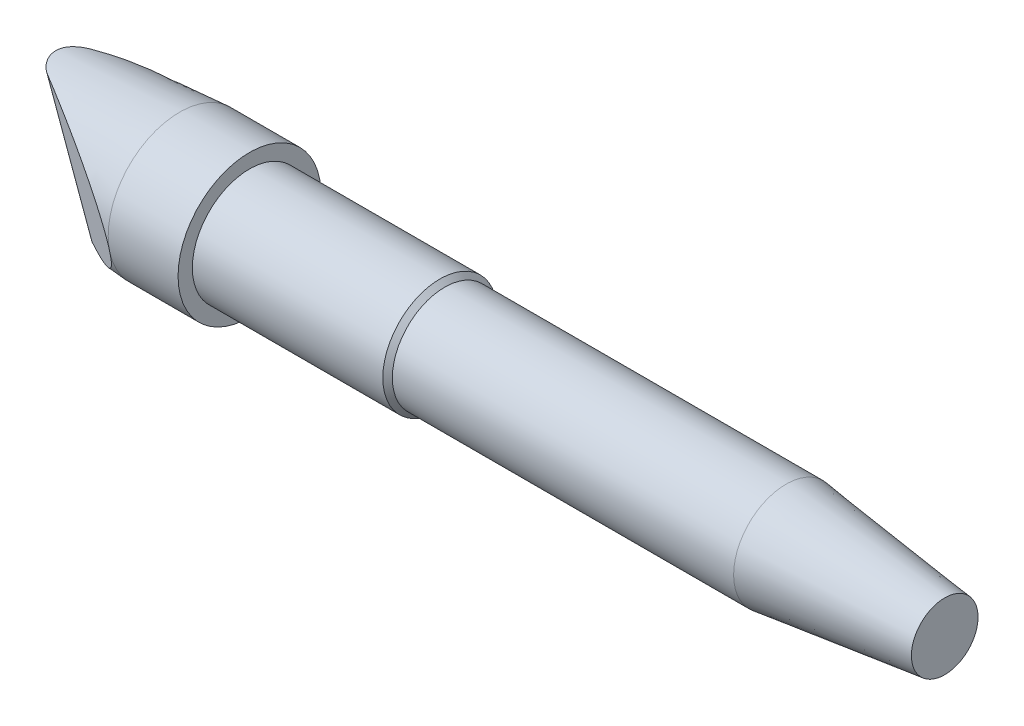
ISO-10303-21;
HEADER;
FILE_DESCRIPTION(('STEP AP214'),'2;1');
FILE_NAME('part.step','',(''),(''),'','','');
FILE_SCHEMA(('AUTOMOTIVE_DESIGN { 1 0 10303 214 1 1 1 1 }'));
ENDSEC;
DATA;
#1=APPLICATION_CONTEXT('core data for automotive mechanical design processes');
#2=APPLICATION_PROTOCOL_DEFINITION('international standard','automotive_design',2000,#1);
#3=PRODUCT_CONTEXT('',#1,'mechanical');
#4=PRODUCT('Part','Part','',(#3));
#5=PRODUCT_RELATED_PRODUCT_CATEGORY('part','',(#4));
#6=PRODUCT_DEFINITION_FORMATION('','',#4);
#7=PRODUCT_DEFINITION_CONTEXT('part definition',#1,'design');
#8=PRODUCT_DEFINITION('design','',#6,#7);
#9=PRODUCT_DEFINITION_SHAPE('','',#8);
#10=(LENGTH_UNIT() NAMED_UNIT(*) SI_UNIT(.MILLI.,.METRE.));
#11=(NAMED_UNIT(*) PLANE_ANGLE_UNIT() SI_UNIT($,.RADIAN.));
#12=(NAMED_UNIT(*) SI_UNIT($,.STERADIAN.) SOLID_ANGLE_UNIT());
#13=UNCERTAINTY_MEASURE_WITH_UNIT(LENGTH_MEASURE(1.E-05),#10,'distance_accuracy_value','');
#14=(GEOMETRIC_REPRESENTATION_CONTEXT(3) GLOBAL_UNCERTAINTY_ASSIGNED_CONTEXT((#13)) GLOBAL_UNIT_ASSIGNED_CONTEXT((#10,
#11,#12)) REPRESENTATION_CONTEXT('',''));
#15=CARTESIAN_POINT('',(0.,0.,0.));
#16=DIRECTION('',(0.,0.,1.));
#17=DIRECTION('',(1.,0.,0.));
#18=AXIS2_PLACEMENT_3D('',#15,#16,#17);
#19=CARTESIAN_POINT('',(4.,0.,0.));
#20=DIRECTION('',(1.,0.,0.));
#21=DIRECTION('',(0.,0.,-1.));
#22=AXIS2_PLACEMENT_3D('',#19,#20,#21);
#23=CONICAL_SURFACE('',#22,2.25,0.0698131700797663);
#24=CARTESIAN_POINT('',(1.94283790432333,-1.98894205411613,0.692801568114352));
#25=CARTESIAN_POINT('',(1.92495020732352,-1.9913928685885,0.681961056082607));
#26=CARTESIAN_POINT('',(1.90757537945854,-1.99405980406043,0.670348568321338));
#27=CARTESIAN_POINT('',(1.87395333563667,-1.99971412591433,0.645678509459631));
#28=CARTESIAN_POINT('',(1.85770552362964,-2.00270134074736,0.632621711846827));
#29=CARTESIAN_POINT('',(1.8109778740217,-2.01194061102231,0.591590386524373));
#30=CARTESIAN_POINT('',(1.78228244958809,-2.01850452409428,0.56161359950724));
#31=CARTESIAN_POINT('',(1.73061380313324,-2.03146572483294,0.49775995071398));
#32=CARTESIAN_POINT('',(1.70757124747699,-2.03786406948404,0.463938662863198));
#33=CARTESIAN_POINT('',(1.66671851176656,-2.04989540222983,0.392623788710022));
#34=CARTESIAN_POINT('',(1.64897130130436,-2.05551878214422,0.355092569553317));
#35=CARTESIAN_POINT('',(1.61918533079151,-2.06530326936349,0.277651062945312));
#36=CARTESIAN_POINT('',(1.60714829053367,-2.06946393602987,0.237740062818997));
#37=CARTESIAN_POINT('',(1.58799458413831,-2.07619941867248,0.15274918210976));
#38=CARTESIAN_POINT('',(1.58142819340432,-2.07859453108642,0.107530279633487));
#39=CARTESIAN_POINT('',(1.57517952037725,-2.08087175764716,0.0165645256611609));
#40=CARTESIAN_POINT('',(1.57549694276551,-2.08075397959809,-0.0291823031024662));
#41=CARTESIAN_POINT('',(1.58301252972349,-2.07801988969587,-0.120035745994189));
#42=CARTESIAN_POINT('',(1.59021087256859,-2.07540351310742,-0.165142343504027));
#43=CARTESIAN_POINT('',(1.61146893555806,-2.06796603895479,-0.253532781756505));
#44=CARTESIAN_POINT('',(1.62552936164068,-2.06314471455937,-0.296816434465544));
#45=CARTESIAN_POINT('',(1.66006806241272,-2.05199676960851,-0.37943858869147));
#46=CARTESIAN_POINT('',(1.68040205714091,-2.04570469201923,-0.418841842745256));
#47=CARTESIAN_POINT('',(1.72639483692153,-2.03264639198457,-0.491940417101323));
#48=CARTESIAN_POINT('',(1.75178666216111,-2.02591224870717,-0.525808451722958));
#49=CARTESIAN_POINT('',(1.80344610069401,-2.01371714235982,-0.583581964661873));
#50=CARTESIAN_POINT('',(1.82889789579975,-2.00822741225835,-0.608211683983511));
#51=CARTESIAN_POINT('',(1.88332900047462,-1.99792557260735,-0.65359804244933));
#52=CARTESIAN_POINT('',(1.91232124946631,-1.99311609623757,-0.674339727056283));
#53=CARTESIAN_POINT('',(1.94283790432166,-1.9889420541133,-0.692801568113151));
#54=B_SPLINE_CURVE_WITH_KNOTS('',3,(#24,#25,#26,#27,#28,#29,#30,#31,#32,#33,#34,#35,#36,#37,#38,
#39,#40,#41,#42,#43,#44,#45,#46,#47,#48,#49,#50,#51,#52,#53),.UNSPECIFIED.,.F.,.F.,(4,2,2,2,2,2,
2,2,2,2,2,2,2,2,4),(0.,0.0631323239263544,0.126231000089858,0.251619765804595,0.375383653775144,
0.500565453758349,0.625784932179108,0.762449405090412,0.899108015046321,1.03577016573848,
1.17244637854238,1.30618800814029,1.4341712563932,1.54131520652667,1.64886316762776),.UNSPECIFIED.);
#55=CARTESIAN_POINT('',(1.94283790432333,-1.98894205411613,0.692801568114352));
#56=VERTEX_POINT('',#55);
#57=CARTESIAN_POINT('',(1.94283790432333,-1.98894205411614,-0.692801568114351));
#58=VERTEX_POINT('',#57);
#59=EDGE_CURVE('E46',#56,#58,#54,.T.);
#60=ORIENTED_EDGE('',*,*,#59,.T.);
#61=CARTESIAN_POINT('',(0.45754359333402,-0.0509607713910976,-0.242510614694185));
#62=DIRECTION('',(0.491920495700621,0.179044418060502,0.852031291837942));
#63=DIRECTION('',(0.870640124224502,-0.101161911143484,-0.48140631676801));
#64=AXIS2_PLACEMENT_3D('',#61,#62,#63);
#65=ELLIPSE('',#64,4.07034741291118,1.98689358081683);
#66=CARTESIAN_POINT('',(4.,-0.516260818740994,-2.18997140781173));
#67=VERTEX_POINT('',#66);
#68=EDGE_CURVE('E11',#58,#67,#65,.T.);
#69=ORIENTED_EDGE('',*,*,#68,.T.);
#70=CARTESIAN_POINT('',(4.,0.,0.));
#71=DIRECTION('',(-1.,0.,0.));
#72=DIRECTION('',(0.,0.,1.));
#73=AXIS2_PLACEMENT_3D('',#70,#71,#72);
#74=CIRCLE('',#73,2.25);
#75=CARTESIAN_POINT('',(4.,-0.516260818740866,2.18997140781176));
#76=VERTEX_POINT('',#75);
#77=EDGE_CURVE('E95',#67,#76,#74,.T.);
#78=ORIENTED_EDGE('',*,*,#77,.T.);
#79=CARTESIAN_POINT('',(0.45754359333402,-0.0509607713910977,0.242510614694185));
#80=DIRECTION('',(0.491920495700621,0.179044418060502,-0.852031291837941));
#81=DIRECTION('',(0.870640124224501,-0.101161911143484,0.481406316768011));
#82=AXIS2_PLACEMENT_3D('',#79,#80,#81);
#83=ELLIPSE('',#82,4.07034741291118,1.98689358081683);
#84=EDGE_CURVE('E88',#76,#56,#83,.T.);
#85=ORIENTED_EDGE('',*,*,#84,.T.);
#86=EDGE_LOOP('',(#60,#69,#78,#85));
#87=FACE_BOUND('',#86,.T.);
#88=ADVANCED_FACE('F36',(#87),#23,.T.);
#89=CARTESIAN_POINT('',(28.1,1.05,0.));
#90=DIRECTION('',(-1.,0.,0.));
#91=DIRECTION('',(0.,0.,1.));
#92=AXIS2_PLACEMENT_3D('',#89,#90,#91);
#93=PLANE('',#92);
#94=CARTESIAN_POINT('',(28.1,0.,0.));
#95=DIRECTION('',(-1.,0.,0.));
#96=DIRECTION('',(0.,0.,1.));
#97=AXIS2_PLACEMENT_3D('',#94,#95,#96);
#98=CIRCLE('',#97,1.05);
#99=CARTESIAN_POINT('',(28.1,0.,1.05));
#100=VERTEX_POINT('',#99);
#101=EDGE_CURVE('E110',#100,#100,#98,.T.);
#102=ORIENTED_EDGE('',*,*,#101,.F.);
#103=EDGE_LOOP('',(#102));
#104=FACE_BOUND('',#103,.T.);
#105=ADVANCED_FACE('F38',(#104),#93,.F.);
#106=CARTESIAN_POINT('',(28.1,0.,0.));
#107=DIRECTION('',(-1.,0.,0.));
#108=DIRECTION('',(0.,0.,1.));
#109=AXIS2_PLACEMENT_3D('',#106,#107,#108);
#110=CONICAL_SURFACE('',#109,1.05,0.119428926018338);
#111=CARTESIAN_POINT('',(23.1,0.,0.));
#112=DIRECTION('',(-1.,0.,0.));
#113=DIRECTION('',(0.,0.,1.));
#114=AXIS2_PLACEMENT_3D('',#111,#112,#113);
#115=CIRCLE('',#114,1.65);
#116=CARTESIAN_POINT('',(23.1,0.,1.65));
#117=VERTEX_POINT('',#116);
#118=EDGE_CURVE('E185',#117,#117,#115,.T.);
#119=ORIENTED_EDGE('',*,*,#118,.F.);
#120=EDGE_LOOP('',(#119));
#121=FACE_BOUND('',#120,.T.);
#122=ORIENTED_EDGE('',*,*,#101,.T.);
#123=EDGE_LOOP('',(#122));
#124=FACE_BOUND('',#123,.T.);
#125=ADVANCED_FACE('F204',(#121,#124),#110,.T.);
#126=CARTESIAN_POINT('',(0.,0.,0.));
#127=DIRECTION('',(-1.,0.,0.));
#128=DIRECTION('',(0.,0.,1.));
#129=AXIS2_PLACEMENT_3D('',#126,#127,#128);
#130=CYLINDRICAL_SURFACE('',#129,1.65);
#131=CARTESIAN_POINT('',(12.35,0.,0.));
#132=DIRECTION('',(-1.,0.,0.));
#133=DIRECTION('',(0.,0.,1.));
#134=AXIS2_PLACEMENT_3D('',#131,#132,#133);
#135=CIRCLE('',#134,1.65);
#136=CARTESIAN_POINT('',(12.35,0.,1.65));
#137=VERTEX_POINT('',#136);
#138=EDGE_CURVE('E182',#137,#137,#135,.T.);
#139=ORIENTED_EDGE('',*,*,#138,.F.);
#140=EDGE_LOOP('',(#139));
#141=FACE_BOUND('',#140,.T.);
#142=ORIENTED_EDGE('',*,*,#118,.T.);
#143=EDGE_LOOP('',(#142));
#144=FACE_BOUND('',#143,.T.);
#145=ADVANCED_FACE('F209',(#141,#144),#130,.T.);
#146=CARTESIAN_POINT('',(12.35,0.,0.));
#147=DIRECTION('',(-1.,0.,0.));
#148=DIRECTION('',(0.,0.,1.));
#149=AXIS2_PLACEMENT_3D('',#146,#147,#148);
#150=CONICAL_SURFACE('',#149,1.65,0.785398163397452);
#151=CARTESIAN_POINT('',(12.2,0.,0.));
#152=DIRECTION('',(-1.,0.,0.));
#153=DIRECTION('',(0.,0.,1.));
#154=AXIS2_PLACEMENT_3D('',#151,#152,#153);
#155=CIRCLE('',#154,1.8);
#156=CARTESIAN_POINT('',(12.2,0.,1.8));
#157=VERTEX_POINT('',#156);
#158=EDGE_CURVE('E177',#157,#157,#155,.T.);
#159=ORIENTED_EDGE('',*,*,#158,.F.);
#160=EDGE_LOOP('',(#159));
#161=FACE_BOUND('',#160,.T.);
#162=ORIENTED_EDGE('',*,*,#138,.T.);
#163=EDGE_LOOP('',(#162));
#164=FACE_BOUND('',#163,.T.);
#165=ADVANCED_FACE('F216',(#161,#164),#150,.T.);
#166=CARTESIAN_POINT('',(0.,0.,0.));
#167=DIRECTION('',(-1.,0.,0.));
#168=DIRECTION('',(0.,0.,1.));
#169=AXIS2_PLACEMENT_3D('',#166,#167,#168);
#170=CYLINDRICAL_SURFACE('',#169,1.8);
#171=CARTESIAN_POINT('',(6.2,0.,0.));
#172=DIRECTION('',(-1.,0.,0.));
#173=DIRECTION('',(0.,0.,1.));
#174=AXIS2_PLACEMENT_3D('',#171,#172,#173);
#175=CIRCLE('',#174,1.8);
#176=CARTESIAN_POINT('',(6.2,0.,1.8));
#177=VERTEX_POINT('',#176);
#178=EDGE_CURVE('E173',#177,#177,#175,.T.);
#179=ORIENTED_EDGE('',*,*,#178,.F.);
#180=EDGE_LOOP('',(#179));
#181=FACE_BOUND('',#180,.T.);
#182=ORIENTED_EDGE('',*,*,#158,.T.);
#183=EDGE_LOOP('',(#182));
#184=FACE_BOUND('',#183,.T.);
#185=ADVANCED_FACE('F222',(#181,#184),#170,.T.);
#186=CARTESIAN_POINT('',(6.2,2.25,0.));
#187=DIRECTION('',(-1.,0.,0.));
#188=DIRECTION('',(0.,0.,1.));
#189=AXIS2_PLACEMENT_3D('',#186,#187,#188);
#190=PLANE('',#189);
#191=CARTESIAN_POINT('',(6.2,0.,0.));
#192=DIRECTION('',(-1.,0.,0.));
#193=DIRECTION('',(0.,0.,1.));
#194=AXIS2_PLACEMENT_3D('',#191,#192,#193);
#195=CIRCLE('',#194,2.25);
#196=CARTESIAN_POINT('',(6.2,0.,2.25));
#197=VERTEX_POINT('',#196);
#198=EDGE_CURVE('E171',#197,#197,#195,.T.);
#199=ORIENTED_EDGE('',*,*,#198,.F.);
#200=EDGE_LOOP('',(#199));
#201=FACE_BOUND('',#200,.T.);
#202=ORIENTED_EDGE('',*,*,#178,.T.);
#203=EDGE_LOOP('',(#202));
#204=FACE_BOUND('',#203,.T.);
#205=ADVANCED_FACE('F126',(#201,#204),#190,.F.);
#206=CARTESIAN_POINT('',(0.,0.,0.));
#207=DIRECTION('',(-1.,0.,0.));
#208=DIRECTION('',(0.,0.,1.));
#209=AXIS2_PLACEMENT_3D('',#206,#207,#208);
#210=CYLINDRICAL_SURFACE('',#209,2.25);
#211=ORIENTED_EDGE('',*,*,#77,.F.);
#212=CARTESIAN_POINT('',(4.,-0.516260818740993,-2.18997140781173));
#213=CARTESIAN_POINT('',(4.00019730595104,-0.511811173062633,-2.19102036367947));
#214=CARTESIAN_POINT('',(4.00036999224715,-0.507357294480481,-2.19205599732996));
#215=CARTESIAN_POINT('',(4.00066601165682,-0.498443303680189,-2.19410008251311));
#216=CARTESIAN_POINT('',(4.00078936196401,-0.493983194178254,-2.19510854340104));
#217=CARTESIAN_POINT('',(4.00098671028385,-0.485056907276706,-2.19709824587287));
#218=CARTESIAN_POINT('',(4.00106071977338,-0.480590731530486,-2.19807949373571));
#219=CARTESIAN_POINT('',(4.00115939349717,-0.47165247950509,-2.20001473752366));
#220=CARTESIAN_POINT('',(4.00118406347371,-0.467180403973179,-2.20096873660735));
#221=CARTESIAN_POINT('',(4.00118406347371,-0.458230519386128,-2.2028494502536));
#222=CARTESIAN_POINT('',(4.00115939349717,-0.453752710330988,-2.20377616481618));
#223=CARTESIAN_POINT('',(4.00106071977338,-0.444791525870758,-2.20560227841014));
#224=CARTESIAN_POINT('',(4.00098671028385,-0.440308149878397,-2.20650167424934));
#225=CARTESIAN_POINT('',(4.00078936196401,-0.431335998740626,-2.20827311934761));
#226=CARTESIAN_POINT('',(4.00066601165682,-0.426847222581473,-2.20914516219332));
#227=CARTESIAN_POINT('',(4.00036999224715,-0.41786443832825,-2.21086187512323));
#228=CARTESIAN_POINT('',(4.00019730595104,-0.413370428955126,-2.21170653555017));
#229=CARTESIAN_POINT('',(4.,-0.408874932230862,-2.21253729681405));
#230=B_SPLINE_CURVE_WITH_KNOTS('',3,(#212,#213,#214,#215,#216,#217,#218,#219,#220,#221,#222,
#223,#224,#225,#226,#227,#228,#229),.UNSPECIFIED.,.F.,.F.,(4,2,2,2,2,2,2,2,4),(0.,
0.0137275228626403,0.0274502574972801,0.041169799051516,0.0548877437868337,0.0686056885221513,
0.0823252300763874,0.0960479647110281,0.109775487573668),.UNSPECIFIED.);
#231=CARTESIAN_POINT('',(4.,-0.408874932230839,-2.21253729681405));
#232=VERTEX_POINT('',#231);
#233=EDGE_CURVE('E146',#67,#232,#230,.T.);
#234=ORIENTED_EDGE('',*,*,#233,.T.);
#235=CARTESIAN_POINT('',(4.,-0.408874932230997,2.21253729681402));
#236=VERTEX_POINT('',#235);
#237=EDGE_CURVE('E101',#236,#232,#74,.T.);
#238=ORIENTED_EDGE('',*,*,#237,.F.);
#239=CARTESIAN_POINT('',(4.,-0.408874932230998,2.21253729681402));
#240=CARTESIAN_POINT('',(4.00019730595104,-0.413370428955251,2.21170653555015));
#241=CARTESIAN_POINT('',(4.00036999224715,-0.417864438328364,2.21086187512321));
#242=CARTESIAN_POINT('',(4.00066601165682,-0.426847222581565,2.2091451621933));
#243=CARTESIAN_POINT('',(4.000789361964,-0.431335998740707,2.20827311934759));
#244=CARTESIAN_POINT('',(4.00098671028384,-0.440308149878455,2.20650167424933));
#245=CARTESIAN_POINT('',(4.00106071977338,-0.444791525870804,2.20560227841013));
#246=CARTESIAN_POINT('',(4.00115939349716,-0.453752710331011,2.20377616481617));
#247=CARTESIAN_POINT('',(4.0011840634737,-0.45823051938614,2.2028494502536));
#248=CARTESIAN_POINT('',(4.0011840634737,-0.467180403973169,2.20096873660735));
#249=CARTESIAN_POINT('',(4.00115939349716,-0.471652479505068,2.20001473752367));
#250=CARTESIAN_POINT('',(4.00106071977338,-0.480590731530442,2.19807949373572));
#251=CARTESIAN_POINT('',(4.00098671028384,-0.48505690727665,2.19709824587288));
#252=CARTESIAN_POINT('',(4.000789361964,-0.493983194178176,2.19510854340106));
#253=CARTESIAN_POINT('',(4.00066601165682,-0.4984433036801,2.19410008251313));
#254=CARTESIAN_POINT('',(4.00036999224715,-0.50735729448037,2.19205599732998));
#255=CARTESIAN_POINT('',(4.00019730595104,-0.511811173062512,2.1910203636795));
#256=CARTESIAN_POINT('',(4.,-0.516260818740861,2.18997140781176));
#257=B_SPLINE_CURVE_WITH_KNOTS('',3,(#239,#240,#241,#242,#243,#244,#245,#246,#247,#248,#249,
#250,#251,#252,#253,#254,#255,#256),.UNSPECIFIED.,.F.,.F.,(4,2,2,2,2,2,2,2,4),(0.,
0.0137275228626063,0.027450257497213,0.041169799051413,0.0548877437866968,0.0686056885219803,
0.0823252300761804,0.0960479647107871,0.109775487573393),.UNSPECIFIED.);
#258=EDGE_CURVE('E53',#236,#76,#257,.T.);
#259=ORIENTED_EDGE('',*,*,#258,.T.);
#260=EDGE_LOOP('',(#211,#234,#238,#259));
#261=FACE_BOUND('',#260,.T.);
#262=ORIENTED_EDGE('',*,*,#198,.T.);
#263=EDGE_LOOP('',(#262));
#264=FACE_BOUND('',#263,.T.);
#265=ADVANCED_FACE('F115',(#261,#264),#210,.T.);
#266=ORIENTED_EDGE('',*,*,#237,.T.);
#267=CARTESIAN_POINT('',(0.533113978882545,1.88424259869733,-0.692801568114351));
#268=VERTEX_POINT('',#267);
#269=EDGE_CURVE('E40',#232,#268,#65,.T.);
#270=ORIENTED_EDGE('',*,*,#269,.T.);
#271=CARTESIAN_POINT('',(0.533113978882544,1.88424259869733,-0.692801568114351));
#272=CARTESIAN_POINT('',(0.490205624194533,1.88973401794708,-0.669156494325727));
#273=CARTESIAN_POINT('',(0.449297172875784,1.89618608600762,-0.642084377333018));
#274=CARTESIAN_POINT('',(0.372556204451294,1.90996779551534,-0.581695480657947));
#275=CARTESIAN_POINT('',(0.336723601114264,1.91729742205018,-0.54837880708388));
#276=CARTESIAN_POINT('',(0.272890546128834,1.93141876835432,-0.477964377323308));
#277=CARTESIAN_POINT('',(0.244582457052589,1.93821878578078,-0.441148526954576));
#278=CARTESIAN_POINT('',(0.196405678375597,1.95034299222264,-0.36587783768609));
#279=CARTESIAN_POINT('',(0.17607638742546,1.95573815699197,-0.327731404284249));
#280=CARTESIAN_POINT('',(0.143201485474602,1.9646895890772,-0.250992815750301));
#281=CARTESIAN_POINT('',(0.130231501593225,1.96834354650089,-0.21259539056126));
#282=CARTESIAN_POINT('',(0.11109102870063,1.97379687347551,-0.135288954040647));
#283=CARTESIAN_POINT('',(0.104719188589476,1.97565104681,-0.0964341753890642));
#284=CARTESIAN_POINT('',(0.0984301371348126,1.97748085121475,-0.0181116898737664));
#285=CARTESIAN_POINT('',(0.0985199293084734,1.97745444399569,0.0213566356832086));
#286=CARTESIAN_POINT('',(0.105136898750295,1.97552979948767,0.0993451672809721));
#287=CARTESIAN_POINT('',(0.11160745296812,1.97364802678411,0.137870659050512));
#288=CARTESIAN_POINT('',(0.130524508050523,1.96826186162048,0.213252393207315));
#289=CARTESIAN_POINT('',(0.142965823374956,1.96475887725877,0.250110053748959));
#290=CARTESIAN_POINT('',(0.173497544402414,1.95643547062687,0.322029597300292));
#291=CARTESIAN_POINT('',(0.191686536412749,1.9515922556069,0.35704665245606));
#292=CARTESIAN_POINT('',(0.232902035656889,1.94111536310709,0.42392451817275));
#293=CARTESIAN_POINT('',(0.255926717647875,1.93548198414226,0.45578651296055));
#294=CARTESIAN_POINT('',(0.315400866864761,1.92181997712721,0.527076665983272));
#295=CARTESIAN_POINT('',(0.353671885565793,1.91367312751894,0.56497125162146));
#296=CARTESIAN_POINT('',(0.437996164512899,1.89799458586496,0.634512773035715));
#297=CARTESIAN_POINT('',(0.484275866658498,1.89049462442782,0.665892967713443));
#298=CARTESIAN_POINT('',(0.533113978882535,1.88424259869728,0.692801568114331));
#299=B_SPLINE_CURVE_WITH_KNOTS('',3,(#271,#272,#273,#274,#275,#276,#277,#278,#279,#280,#281,
#282,#283,#284,#285,#286,#287,#288,#289,#290,#291,#292,#293,#294,#295,#296,#297,#298),
.UNSPECIFIED.,.F.,.F.,(4,2,2,2,2,2,2,2,2,2,2,2,2,4),(0.,0.147754130402889,0.295505750376507,
0.435672436220405,0.565756313762233,0.687274935137659,0.804964978961389,0.922782584461144,
1.03956399687718,1.15624416896525,1.27504553838094,1.39380214626564,1.55628391995781,
1.72448269940738),.UNSPECIFIED.);
#300=CARTESIAN_POINT('',(0.533113978882545,1.88424259869733,0.692801568114352));
#301=VERTEX_POINT('',#300);
#302=EDGE_CURVE('E97',#268,#301,#299,.T.);
#303=ORIENTED_EDGE('',*,*,#302,.T.);
#304=EDGE_CURVE('E91',#301,#236,#83,.T.);
#305=ORIENTED_EDGE('',*,*,#304,.T.);
#306=EDGE_LOOP('',(#266,#270,#303,#305));
#307=FACE_BOUND('',#306,.T.);
#308=ADVANCED_FACE('F125',(#307),#23,.T.);
#309=CARTESIAN_POINT('',(3.82019060510251,-7.14692620785908,-0.692801568114351));
#310=DIRECTION('',(0.491920495700621,0.179044418060502,0.852031291837942));
#311=DIRECTION('',(0.866025403784438,0.,-0.5));
#312=AXIS2_PLACEMENT_3D('',#309,#310,#311);
#313=PLANE('',#312);
#314=ORIENTED_EDGE('',*,*,#233,.F.);
#315=ORIENTED_EDGE('',*,*,#68,.F.);
#316=DIRECTION('',(-0.342020143325669,0.939692620785908,0.));
#317=VECTOR('',#316,1.);
#318=CARTESIAN_POINT('',(3.82019060510251,-7.14692620785908,-0.692801568114351));
#319=LINE('',#318,#317);
#320=EDGE_CURVE('E85',#58,#268,#319,.T.);
#321=ORIENTED_EDGE('',*,*,#320,.T.);
#322=ORIENTED_EDGE('',*,*,#269,.F.);
#323=EDGE_LOOP('',(#314,#315,#321,#322));
#324=FACE_BOUND('',#323,.T.);
#325=ADVANCED_FACE('F152',(#324),#313,.F.);
#326=CARTESIAN_POINT('',(4.22017977694833,-7.14692620785908,0.));
#327=DIRECTION('',(0.,-1.,0.));
#328=DIRECTION('',(0.,0.,-1.));
#329=AXIS2_PLACEMENT_3D('',#326,#327,#328);
#330=CIRCLE('',#329,0.799978343691632);
#331=DIRECTION('',(-0.342020143325669,0.939692620785908,0.));
#332=VECTOR('',#331,1.);
#333=SURFACE_OF_LINEAR_EXTRUSION('',#330,#332);
#334=ORIENTED_EDGE('',*,*,#320,.F.);
#335=ORIENTED_EDGE('',*,*,#59,.F.);
#336=DIRECTION('',(-0.342020143325669,0.939692620785908,0.));
#337=VECTOR('',#336,1.);
#338=CARTESIAN_POINT('',(3.82019060510251,-7.14692620785908,0.692801568114352));
#339=LINE('',#338,#337);
#340=EDGE_CURVE('E83',#56,#301,#339,.T.);
#341=ORIENTED_EDGE('',*,*,#340,.T.);
#342=ORIENTED_EDGE('',*,*,#302,.F.);
#343=EDGE_LOOP('',(#334,#335,#341,#342));
#344=FACE_BOUND('',#343,.T.);
#345=ADVANCED_FACE('F82',(#344),#333,.F.);
#346=CARTESIAN_POINT('',(10.4202014332567,-7.14692620785908,4.50331959640362));
#347=DIRECTION('',(0.491920495700621,0.179044418060502,-0.852031291837941));
#348=DIRECTION('',(-0.866025403784438,0.,-0.500000000000001));
#349=AXIS2_PLACEMENT_3D('',#346,#347,#348);
#350=PLANE('',#349);
#351=ORIENTED_EDGE('',*,*,#258,.F.);
#352=ORIENTED_EDGE('',*,*,#304,.F.);
#353=ORIENTED_EDGE('',*,*,#340,.F.);
#354=ORIENTED_EDGE('',*,*,#84,.F.);
#355=EDGE_LOOP('',(#351,#352,#353,#354));
#356=FACE_BOUND('',#355,.T.);
#357=ADVANCED_FACE('F90',(#356),#350,.F.);
#358=CLOSED_SHELL('',(#88,#105,#125,#145,#165,#185,#205,#265,#308,#325,#345,#357));
#359=MANIFOLD_SOLID_BREP('B2',#358);
#360=ADVANCED_BREP_SHAPE_REPRESENTATION('',(#18,#359),#14);
#361=SHAPE_DEFINITION_REPRESENTATION(#9,#360);
ENDSEC;
END-ISO-10303-21;
